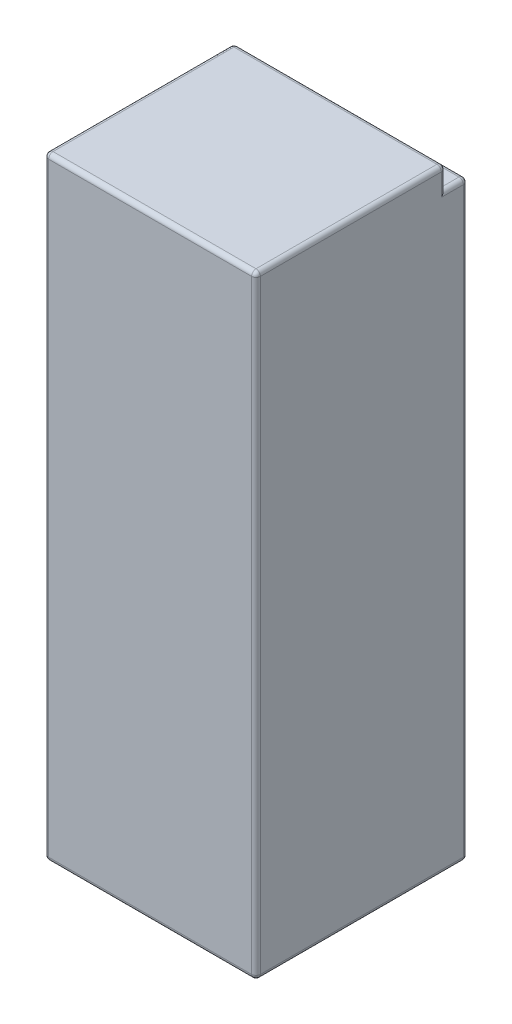
ISO-10303-21;
HEADER;
FILE_DESCRIPTION(('STEP AP214'),'2;1');
FILE_NAME('part.step','',(''),(''),'','','');
FILE_SCHEMA(('AUTOMOTIVE_DESIGN { 1 0 10303 214 1 1 1 1 }'));
ENDSEC;
DATA;
#1=APPLICATION_CONTEXT('core data for automotive mechanical design processes');
#2=APPLICATION_PROTOCOL_DEFINITION('international standard','automotive_design',2000,#1);
#3=PRODUCT_CONTEXT('',#1,'mechanical');
#4=PRODUCT('Part','Part','',(#3));
#5=PRODUCT_RELATED_PRODUCT_CATEGORY('part','',(#4));
#6=PRODUCT_DEFINITION_FORMATION('','',#4);
#7=PRODUCT_DEFINITION_CONTEXT('part definition',#1,'design');
#8=PRODUCT_DEFINITION('design','',#6,#7);
#9=PRODUCT_DEFINITION_SHAPE('','',#8);
#10=(LENGTH_UNIT() NAMED_UNIT(*) SI_UNIT(.MILLI.,.METRE.));
#11=(NAMED_UNIT(*) PLANE_ANGLE_UNIT() SI_UNIT($,.RADIAN.));
#12=(NAMED_UNIT(*) SI_UNIT($,.STERADIAN.) SOLID_ANGLE_UNIT());
#13=UNCERTAINTY_MEASURE_WITH_UNIT(LENGTH_MEASURE(1.E-05),#10,'distance_accuracy_value','');
#14=(GEOMETRIC_REPRESENTATION_CONTEXT(3) GLOBAL_UNCERTAINTY_ASSIGNED_CONTEXT((#13)) GLOBAL_UNIT_ASSIGNED_CONTEXT((#10,
#11,#12)) REPRESENTATION_CONTEXT('',''));
#15=CARTESIAN_POINT('',(0.,0.,0.));
#16=DIRECTION('',(0.,0.,1.));
#17=DIRECTION('',(1.,0.,0.));
#18=AXIS2_PLACEMENT_3D('',#15,#16,#17);
#19=CARTESIAN_POINT('',(-24.,69.5,24.));
#20=DIRECTION('',(1.,0.,0.));
#21=DIRECTION('',(0.,0.,-1.));
#22=AXIS2_PLACEMENT_3D('',#19,#20,#21);
#23=PLANE('',#22);
#24=DIRECTION('',(0.,-1.,0.));
#25=VECTOR('',#24,1.);
#26=CARTESIAN_POINT('',(-24.,69.5,-18.));
#27=LINE('',#26,#25);
#28=CARTESIAN_POINT('',(-24.,68.5,-18.));
#29=VERTEX_POINT('',#28);
#30=CARTESIAN_POINT('',(-24.,63.5,-18.));
#31=VERTEX_POINT('',#30);
#32=EDGE_CURVE('E251',#29,#31,#27,.T.);
#33=ORIENTED_EDGE('',*,*,#32,.T.);
#34=DIRECTION('',(0.,0.,-1.));
#35=VECTOR('',#34,1.);
#36=CARTESIAN_POINT('',(-24.,63.5,24.));
#37=LINE('',#36,#35);
#38=CARTESIAN_POINT('',(-24.,63.5,-23.));
#39=VERTEX_POINT('',#38);
#40=EDGE_CURVE('E203',#31,#39,#37,.T.);
#41=ORIENTED_EDGE('',*,*,#40,.T.);
#42=DIRECTION('',(0.,-1.,0.));
#43=VECTOR('',#42,1.);
#44=CARTESIAN_POINT('',(-24.,69.5,-23.));
#45=LINE('',#44,#43);
#46=CARTESIAN_POINT('',(-24.,-68.5,-23.));
#47=VERTEX_POINT('',#46);
#48=EDGE_CURVE('E253',#39,#47,#45,.T.);
#49=ORIENTED_EDGE('',*,*,#48,.T.);
#50=DIRECTION('',(0.,0.,1.));
#51=VECTOR('',#50,1.);
#52=CARTESIAN_POINT('',(-24.,-68.5,24.));
#53=LINE('',#52,#51);
#54=CARTESIAN_POINT('',(-24.,-68.5,23.));
#55=VERTEX_POINT('',#54);
#56=EDGE_CURVE('E248',#47,#55,#53,.T.);
#57=ORIENTED_EDGE('',*,*,#56,.T.);
#58=DIRECTION('',(0.,-1.,0.));
#59=VECTOR('',#58,1.);
#60=CARTESIAN_POINT('',(-24.,69.5,23.));
#61=LINE('',#60,#59);
#62=CARTESIAN_POINT('',(-24.,68.5,23.));
#63=VERTEX_POINT('',#62);
#64=EDGE_CURVE('E242',#55,#63,#61,.F.);
#65=ORIENTED_EDGE('',*,*,#64,.T.);
#66=DIRECTION('',(0.,0.,1.));
#67=VECTOR('',#66,1.);
#68=CARTESIAN_POINT('',(-24.,68.5,-19.));
#69=LINE('',#68,#67);
#70=EDGE_CURVE('E245',#63,#29,#69,.F.);
#71=ORIENTED_EDGE('',*,*,#70,.T.);
#72=EDGE_LOOP('',(#33,#41,#49,#57,#65,#71));
#73=FACE_BOUND('',#72,.T.);
#74=ADVANCED_FACE('F42',(#73),#23,.F.);
#75=CARTESIAN_POINT('',(24.,69.5,24.));
#76=DIRECTION('',(0.,0.,-1.));
#77=DIRECTION('',(-1.,0.,0.));
#78=AXIS2_PLACEMENT_3D('',#75,#76,#77);
#79=PLANE('',#78);
#80=DIRECTION('',(1.,0.,0.));
#81=VECTOR('',#80,1.);
#82=CARTESIAN_POINT('',(24.,-68.5,24.));
#83=LINE('',#82,#81);
#84=CARTESIAN_POINT('',(-23.,-68.5,24.));
#85=VERTEX_POINT('',#84);
#86=CARTESIAN_POINT('',(23.,-68.5,24.));
#87=VERTEX_POINT('',#86);
#88=EDGE_CURVE('E52',#85,#87,#83,.T.);
#89=ORIENTED_EDGE('',*,*,#88,.T.);
#90=DIRECTION('',(0.,-1.,0.));
#91=VECTOR('',#90,1.);
#92=CARTESIAN_POINT('',(23.,69.5,24.));
#93=LINE('',#92,#91);
#94=CARTESIAN_POINT('',(23.,68.5,24.));
#95=VERTEX_POINT('',#94);
#96=EDGE_CURVE('E11',#87,#95,#93,.F.);
#97=ORIENTED_EDGE('',*,*,#96,.T.);
#98=DIRECTION('',(1.,0.,0.));
#99=VECTOR('',#98,1.);
#100=CARTESIAN_POINT('',(-24.,68.5,24.));
#101=LINE('',#100,#99);
#102=CARTESIAN_POINT('',(-23.,68.5,24.));
#103=VERTEX_POINT('',#102);
#104=EDGE_CURVE('E296',#95,#103,#101,.F.);
#105=ORIENTED_EDGE('',*,*,#104,.T.);
#106=DIRECTION('',(0.,-1.,0.));
#107=VECTOR('',#106,1.);
#108=CARTESIAN_POINT('',(-23.,69.5,24.));
#109=LINE('',#108,#107);
#110=EDGE_CURVE('E293',#103,#85,#109,.T.);
#111=ORIENTED_EDGE('',*,*,#110,.T.);
#112=EDGE_LOOP('',(#89,#97,#105,#111));
#113=FACE_BOUND('',#112,.T.);
#114=ADVANCED_FACE('F465',(#113),#79,.F.);
#115=CARTESIAN_POINT('',(24.,69.5,24.));
#116=DIRECTION('',(-1.,0.,0.));
#117=DIRECTION('',(0.,0.,1.));
#118=AXIS2_PLACEMENT_3D('',#115,#116,#117);
#119=PLANE('',#118);
#120=DIRECTION('',(0.,-1.,0.));
#121=VECTOR('',#120,1.);
#122=CARTESIAN_POINT('',(24.,69.5,-18.));
#123=LINE('',#122,#121);
#124=CARTESIAN_POINT('',(24.,63.5,-18.));
#125=VERTEX_POINT('',#124);
#126=CARTESIAN_POINT('',(24.,68.5,-18.));
#127=VERTEX_POINT('',#126);
#128=EDGE_CURVE('E231',#125,#127,#123,.F.);
#129=ORIENTED_EDGE('',*,*,#128,.T.);
#130=DIRECTION('',(0.,0.,-1.));
#131=VECTOR('',#130,1.);
#132=CARTESIAN_POINT('',(24.,68.5,24.));
#133=LINE('',#132,#131);
#134=CARTESIAN_POINT('',(24.,68.5,23.));
#135=VERTEX_POINT('',#134);
#136=EDGE_CURVE('E237',#127,#135,#133,.F.);
#137=ORIENTED_EDGE('',*,*,#136,.T.);
#138=DIRECTION('',(0.,-1.,0.));
#139=VECTOR('',#138,1.);
#140=CARTESIAN_POINT('',(24.,69.5,23.));
#141=LINE('',#140,#139);
#142=CARTESIAN_POINT('',(24.,-68.5,23.));
#143=VERTEX_POINT('',#142);
#144=EDGE_CURVE('E234',#135,#143,#141,.T.);
#145=ORIENTED_EDGE('',*,*,#144,.T.);
#146=DIRECTION('',(0.,0.,-1.));
#147=VECTOR('',#146,1.);
#148=CARTESIAN_POINT('',(24.,-68.5,24.));
#149=LINE('',#148,#147);
#150=CARTESIAN_POINT('',(24.,-68.5,-23.));
#151=VERTEX_POINT('',#150);
#152=EDGE_CURVE('E226',#143,#151,#149,.T.);
#153=ORIENTED_EDGE('',*,*,#152,.T.);
#154=DIRECTION('',(0.,-1.,0.));
#155=VECTOR('',#154,1.);
#156=CARTESIAN_POINT('',(24.,69.5,-23.));
#157=LINE('',#156,#155);
#158=CARTESIAN_POINT('',(24.,63.5,-23.));
#159=VERTEX_POINT('',#158);
#160=EDGE_CURVE('E219',#151,#159,#157,.F.);
#161=ORIENTED_EDGE('',*,*,#160,.T.);
#162=DIRECTION('',(0.,0.,-1.));
#163=VECTOR('',#162,1.);
#164=CARTESIAN_POINT('',(24.,63.5,24.));
#165=LINE('',#164,#163);
#166=EDGE_CURVE('E229',#159,#125,#165,.F.);
#167=ORIENTED_EDGE('',*,*,#166,.T.);
#168=EDGE_LOOP('',(#129,#137,#145,#153,#161,#167));
#169=FACE_BOUND('',#168,.T.);
#170=ADVANCED_FACE('F447',(#169),#119,.F.);
#171=CARTESIAN_POINT('',(24.,69.5,-24.));
#172=DIRECTION('',(0.,0.,1.));
#173=DIRECTION('',(1.,0.,0.));
#174=AXIS2_PLACEMENT_3D('',#171,#172,#173);
#175=PLANE('',#174);
#176=DIRECTION('',(-1.,0.,0.));
#177=VECTOR('',#176,1.);
#178=CARTESIAN_POINT('',(24.,-68.5,-24.));
#179=LINE('',#178,#177);
#180=CARTESIAN_POINT('',(23.,-68.5,-24.));
#181=VERTEX_POINT('',#180);
#182=CARTESIAN_POINT('',(-23.,-68.5,-24.));
#183=VERTEX_POINT('',#182);
#184=EDGE_CURVE('E272',#181,#183,#179,.T.);
#185=ORIENTED_EDGE('',*,*,#184,.T.);
#186=DIRECTION('',(0.,-1.,0.));
#187=VECTOR('',#186,1.);
#188=CARTESIAN_POINT('',(-23.,69.5,-24.));
#189=LINE('',#188,#187);
#190=CARTESIAN_POINT('',(-23.,63.5,-24.));
#191=VERTEX_POINT('',#190);
#192=EDGE_CURVE('E278',#183,#191,#189,.F.);
#193=ORIENTED_EDGE('',*,*,#192,.T.);
#194=DIRECTION('',(1.,0.,0.));
#195=VECTOR('',#194,1.);
#196=CARTESIAN_POINT('',(24.,63.5,-24.));
#197=LINE('',#196,#195);
#198=CARTESIAN_POINT('',(23.,63.5,-24.));
#199=VERTEX_POINT('',#198);
#200=EDGE_CURVE('E274',#191,#199,#197,.T.);
#201=ORIENTED_EDGE('',*,*,#200,.T.);
#202=DIRECTION('',(0.,-1.,0.));
#203=VECTOR('',#202,1.);
#204=CARTESIAN_POINT('',(23.,69.5,-24.));
#205=LINE('',#204,#203);
#206=EDGE_CURVE('E269',#199,#181,#205,.T.);
#207=ORIENTED_EDGE('',*,*,#206,.T.);
#208=EDGE_LOOP('',(#185,#193,#201,#207));
#209=FACE_BOUND('',#208,.T.);
#210=ADVANCED_FACE('F425',(#209),#175,.F.);
#211=CARTESIAN_POINT('',(0.,69.5,0.));
#212=DIRECTION('',(0.,1.,0.));
#213=DIRECTION('',(0.,0.,1.));
#214=AXIS2_PLACEMENT_3D('',#211,#212,#213);
#215=PLANE('',#214);
#216=DIRECTION('',(0.,0.,-1.));
#217=VECTOR('',#216,1.);
#218=CARTESIAN_POINT('',(23.,69.5,-19.));
#219=LINE('',#218,#217);
#220=CARTESIAN_POINT('',(23.,69.5,23.));
#221=VERTEX_POINT('',#220);
#222=CARTESIAN_POINT('',(23.,69.5,-18.));
#223=VERTEX_POINT('',#222);
#224=EDGE_CURVE('E258',#221,#223,#219,.T.);
#225=ORIENTED_EDGE('',*,*,#224,.T.);
#226=DIRECTION('',(1.,0.,0.));
#227=VECTOR('',#226,1.);
#228=CARTESIAN_POINT('',(-24.,69.5,-18.));
#229=LINE('',#228,#227);
#230=CARTESIAN_POINT('',(-23.,69.5,-18.));
#231=VERTEX_POINT('',#230);
#232=EDGE_CURVE('E265',#223,#231,#229,.F.);
#233=ORIENTED_EDGE('',*,*,#232,.T.);
#234=DIRECTION('',(0.,0.,1.));
#235=VECTOR('',#234,1.);
#236=CARTESIAN_POINT('',(-23.,69.5,24.));
#237=LINE('',#236,#235);
#238=CARTESIAN_POINT('',(-23.,69.5,23.));
#239=VERTEX_POINT('',#238);
#240=EDGE_CURVE('E262',#231,#239,#237,.T.);
#241=ORIENTED_EDGE('',*,*,#240,.T.);
#242=DIRECTION('',(1.,0.,0.));
#243=VECTOR('',#242,1.);
#244=CARTESIAN_POINT('',(24.,69.5,23.));
#245=LINE('',#244,#243);
#246=EDGE_CURVE('E260',#239,#221,#245,.T.);
#247=ORIENTED_EDGE('',*,*,#246,.T.);
#248=EDGE_LOOP('',(#225,#233,#241,#247));
#249=FACE_BOUND('',#248,.T.);
#250=ADVANCED_FACE('F532',(#249),#215,.T.);
#251=CARTESIAN_POINT('',(0.,-69.5,0.));
#252=DIRECTION('',(0.,1.,0.));
#253=DIRECTION('',(0.,0.,1.));
#254=AXIS2_PLACEMENT_3D('',#251,#252,#253);
#255=PLANE('',#254);
#256=DIRECTION('',(1.,0.,0.));
#257=VECTOR('',#256,1.);
#258=CARTESIAN_POINT('',(0.,-69.5,23.));
#259=LINE('',#258,#257);
#260=CARTESIAN_POINT('',(23.,-69.5,23.));
#261=VERTEX_POINT('',#260);
#262=CARTESIAN_POINT('',(-23.,-69.5,23.));
#263=VERTEX_POINT('',#262);
#264=EDGE_CURVE('E286',#261,#263,#259,.F.);
#265=ORIENTED_EDGE('',*,*,#264,.T.);
#266=DIRECTION('',(0.,0.,1.));
#267=VECTOR('',#266,1.);
#268=CARTESIAN_POINT('',(-23.,-69.5,0.));
#269=LINE('',#268,#267);
#270=CARTESIAN_POINT('',(-23.,-69.5,-23.));
#271=VERTEX_POINT('',#270);
#272=EDGE_CURVE('E289',#263,#271,#269,.F.);
#273=ORIENTED_EDGE('',*,*,#272,.T.);
#274=DIRECTION('',(-1.,0.,0.));
#275=VECTOR('',#274,1.);
#276=CARTESIAN_POINT('',(0.,-69.5,-23.));
#277=LINE('',#276,#275);
#278=CARTESIAN_POINT('',(23.,-69.5,-23.));
#279=VERTEX_POINT('',#278);
#280=EDGE_CURVE('E281',#271,#279,#277,.F.);
#281=ORIENTED_EDGE('',*,*,#280,.T.);
#282=DIRECTION('',(0.,0.,-1.));
#283=VECTOR('',#282,1.);
#284=CARTESIAN_POINT('',(23.,-69.5,0.));
#285=LINE('',#284,#283);
#286=EDGE_CURVE('E283',#279,#261,#285,.F.);
#287=ORIENTED_EDGE('',*,*,#286,.T.);
#288=EDGE_LOOP('',(#265,#273,#281,#287));
#289=FACE_BOUND('',#288,.T.);
#290=ADVANCED_FACE('F434',(#289),#255,.F.);
#291=CARTESIAN_POINT('',(-24.,64.5,-24.));
#292=DIRECTION('',(0.,-1.,0.));
#293=DIRECTION('',(0.,0.,-1.));
#294=AXIS2_PLACEMENT_3D('',#291,#292,#293);
#295=PLANE('',#294);
#296=DIRECTION('',(1.,0.,0.));
#297=VECTOR('',#296,1.);
#298=CARTESIAN_POINT('',(-24.,64.5,-19.));
#299=LINE('',#298,#297);
#300=CARTESIAN_POINT('',(-23.,64.5,-19.));
#301=VERTEX_POINT('',#300);
#302=CARTESIAN_POINT('',(23.,64.5,-19.));
#303=VERTEX_POINT('',#302);
#304=EDGE_CURVE('E179',#301,#303,#299,.T.);
#305=ORIENTED_EDGE('',*,*,#304,.T.);
#306=DIRECTION('',(0.,0.,-1.));
#307=VECTOR('',#306,1.);
#308=CARTESIAN_POINT('',(23.,64.5,-24.));
#309=LINE('',#308,#307);
#310=CARTESIAN_POINT('',(23.,64.5,-23.));
#311=VERTEX_POINT('',#310);
#312=EDGE_CURVE('E187',#303,#311,#309,.T.);
#313=ORIENTED_EDGE('',*,*,#312,.T.);
#314=DIRECTION('',(1.,0.,0.));
#315=VECTOR('',#314,1.);
#316=CARTESIAN_POINT('',(-24.,64.5,-23.));
#317=LINE('',#316,#315);
#318=CARTESIAN_POINT('',(-23.,64.5,-23.));
#319=VERTEX_POINT('',#318);
#320=EDGE_CURVE('E181',#311,#319,#317,.F.);
#321=ORIENTED_EDGE('',*,*,#320,.T.);
#322=DIRECTION('',(0.,0.,-1.));
#323=VECTOR('',#322,1.);
#324=CARTESIAN_POINT('',(-23.,64.5,-24.));
#325=LINE('',#324,#323);
#326=EDGE_CURVE('E176',#319,#301,#325,.F.);
#327=ORIENTED_EDGE('',*,*,#326,.T.);
#328=EDGE_LOOP('',(#305,#313,#321,#327));
#329=FACE_BOUND('',#328,.T.);
#330=ADVANCED_FACE('F178',(#329),#295,.F.);
#331=CARTESIAN_POINT('',(-24.,69.5,-19.));
#332=DIRECTION('',(0.,0.,1.));
#333=DIRECTION('',(1.,0.,0.));
#334=AXIS2_PLACEMENT_3D('',#331,#332,#333);
#335=PLANE('',#334);
#336=DIRECTION('',(1.,0.,0.));
#337=VECTOR('',#336,1.);
#338=CARTESIAN_POINT('',(24.,68.5,-19.));
#339=LINE('',#338,#337);
#340=CARTESIAN_POINT('',(-23.,68.5,-19.));
#341=VERTEX_POINT('',#340);
#342=CARTESIAN_POINT('',(23.,68.5,-19.));
#343=VERTEX_POINT('',#342);
#344=EDGE_CURVE('E198',#341,#343,#339,.T.);
#345=ORIENTED_EDGE('',*,*,#344,.T.);
#346=DIRECTION('',(0.,-1.,0.));
#347=VECTOR('',#346,1.);
#348=CARTESIAN_POINT('',(23.,69.5,-19.));
#349=LINE('',#348,#347);
#350=EDGE_CURVE('E196',#343,#303,#349,.T.);
#351=ORIENTED_EDGE('',*,*,#350,.T.);
#352=ORIENTED_EDGE('',*,*,#304,.F.);
#353=DIRECTION('',(0.,-1.,0.));
#354=VECTOR('',#353,1.);
#355=CARTESIAN_POINT('',(-23.,69.5,-19.));
#356=LINE('',#355,#354);
#357=EDGE_CURVE('E193',#301,#341,#356,.F.);
#358=ORIENTED_EDGE('',*,*,#357,.T.);
#359=EDGE_LOOP('',(#345,#351,#352,#358));
#360=FACE_BOUND('',#359,.T.);
#361=ADVANCED_FACE('F191',(#360),#335,.F.);
#362=CARTESIAN_POINT('',(-23.,-68.5,23.));
#363=DIRECTION('',(0.,-1.,0.));
#364=DIRECTION('',(0.,0.,-1.));
#365=AXIS2_PLACEMENT_3D('',#362,#363,#364);
#366=SPHERICAL_SURFACE('',#365,1.);
#367=CARTESIAN_POINT('',(-23.,-68.5,23.));
#368=DIRECTION('',(0.,-1.,0.));
#369=DIRECTION('',(0.,0.,-1.));
#370=AXIS2_PLACEMENT_3D('',#367,#368,#369);
#371=CIRCLE('',#370,1.);
#372=EDGE_CURVE('E382',#55,#85,#371,.F.);
#373=ORIENTED_EDGE('',*,*,#372,.F.);
#374=CARTESIAN_POINT('',(-23.,-68.5,23.));
#375=DIRECTION('',(0.,0.,1.));
#376=DIRECTION('',(1.,0.,0.));
#377=AXIS2_PLACEMENT_3D('',#374,#375,#376);
#378=CIRCLE('',#377,1.);
#379=EDGE_CURVE('E46',#263,#55,#378,.F.);
#380=ORIENTED_EDGE('',*,*,#379,.F.);
#381=CARTESIAN_POINT('',(-23.,-68.5,23.));
#382=DIRECTION('',(-1.,0.,0.));
#383=DIRECTION('',(0.,0.,1.));
#384=AXIS2_PLACEMENT_3D('',#381,#382,#383);
#385=CIRCLE('',#384,1.);
#386=EDGE_CURVE('E385',#85,#263,#385,.F.);
#387=ORIENTED_EDGE('',*,*,#386,.F.);
#388=EDGE_LOOP('',(#373,#380,#387));
#389=FACE_BOUND('',#388,.T.);
#390=ADVANCED_FACE('F44',(#389),#366,.T.);
#391=CARTESIAN_POINT('',(-23.,-68.5,24.));
#392=DIRECTION('',(0.,0.,1.));
#393=DIRECTION('',(1.,0.,0.));
#394=AXIS2_PLACEMENT_3D('',#391,#392,#393);
#395=CYLINDRICAL_SURFACE('',#394,1.);
#396=ORIENTED_EDGE('',*,*,#379,.T.);
#397=ORIENTED_EDGE('',*,*,#56,.F.);
#398=CARTESIAN_POINT('',(-23.,-68.5,-23.));
#399=DIRECTION('',(0.,0.,-1.));
#400=DIRECTION('',(-1.,0.,0.));
#401=AXIS2_PLACEMENT_3D('',#398,#399,#400);
#402=CIRCLE('',#401,1.);
#403=EDGE_CURVE('E379',#271,#47,#402,.T.);
#404=ORIENTED_EDGE('',*,*,#403,.F.);
#405=ORIENTED_EDGE('',*,*,#272,.F.);
#406=EDGE_LOOP('',(#396,#397,#404,#405));
#407=FACE_BOUND('',#406,.T.);
#408=ADVANCED_FACE('F399',(#407),#395,.T.);
#409=CARTESIAN_POINT('',(24.,-68.5,23.));
#410=DIRECTION('',(1.,0.,0.));
#411=DIRECTION('',(0.,0.,-1.));
#412=AXIS2_PLACEMENT_3D('',#409,#410,#411);
#413=CYLINDRICAL_SURFACE('',#412,1.);
#414=ORIENTED_EDGE('',*,*,#386,.T.);
#415=ORIENTED_EDGE('',*,*,#264,.F.);
#416=CARTESIAN_POINT('',(23.,-68.5,23.));
#417=DIRECTION('',(1.,0.,0.));
#418=DIRECTION('',(0.,0.,-1.));
#419=AXIS2_PLACEMENT_3D('',#416,#417,#418);
#420=CIRCLE('',#419,1.);
#421=EDGE_CURVE('E375',#87,#261,#420,.T.);
#422=ORIENTED_EDGE('',*,*,#421,.F.);
#423=ORIENTED_EDGE('',*,*,#88,.F.);
#424=EDGE_LOOP('',(#414,#415,#422,#423));
#425=FACE_BOUND('',#424,.T.);
#426=ADVANCED_FACE('F437',(#425),#413,.T.);
#427=CARTESIAN_POINT('',(-23.,69.5,23.));
#428=DIRECTION('',(0.,-1.,0.));
#429=DIRECTION('',(0.,0.,-1.));
#430=AXIS2_PLACEMENT_3D('',#427,#428,#429);
#431=CYLINDRICAL_SURFACE('',#430,1.);
#432=ORIENTED_EDGE('',*,*,#372,.T.);
#433=ORIENTED_EDGE('',*,*,#110,.F.);
#434=CARTESIAN_POINT('',(-23.,68.5,23.));
#435=DIRECTION('',(0.,1.,0.));
#436=DIRECTION('',(0.,0.,1.));
#437=AXIS2_PLACEMENT_3D('',#434,#435,#436);
#438=CIRCLE('',#437,1.);
#439=EDGE_CURVE('E372',#63,#103,#438,.T.);
#440=ORIENTED_EDGE('',*,*,#439,.F.);
#441=ORIENTED_EDGE('',*,*,#64,.F.);
#442=EDGE_LOOP('',(#432,#433,#440,#441));
#443=FACE_BOUND('',#442,.T.);
#444=ADVANCED_FACE('F406',(#443),#431,.T.);
#445=CARTESIAN_POINT('',(-23.,-68.5,-23.));
#446=DIRECTION('',(-1.,0.,0.));
#447=DIRECTION('',(0.,0.,1.));
#448=AXIS2_PLACEMENT_3D('',#445,#446,#447);
#449=SPHERICAL_SURFACE('',#448,1.);
#450=CARTESIAN_POINT('',(-23.,-68.5,-23.));
#451=DIRECTION('',(-1.,0.,0.));
#452=DIRECTION('',(0.,0.,1.));
#453=AXIS2_PLACEMENT_3D('',#450,#451,#452);
#454=CIRCLE('',#453,1.);
#455=EDGE_CURVE('E366',#271,#183,#454,.F.);
#456=ORIENTED_EDGE('',*,*,#455,.F.);
#457=ORIENTED_EDGE('',*,*,#403,.T.);
#458=CARTESIAN_POINT('',(-23.,-68.5,-23.));
#459=DIRECTION('',(0.,-1.,0.));
#460=DIRECTION('',(0.,0.,-1.));
#461=AXIS2_PLACEMENT_3D('',#458,#459,#460);
#462=CIRCLE('',#461,1.);
#463=EDGE_CURVE('E369',#183,#47,#462,.F.);
#464=ORIENTED_EDGE('',*,*,#463,.F.);
#465=EDGE_LOOP('',(#456,#457,#464));
#466=FACE_BOUND('',#465,.T.);
#467=ADVANCED_FACE('F432',(#466),#449,.T.);
#468=CARTESIAN_POINT('',(23.,-68.5,23.));
#469=DIRECTION('',(0.,-1.,0.));
#470=DIRECTION('',(0.,0.,-1.));
#471=AXIS2_PLACEMENT_3D('',#468,#469,#470);
#472=SPHERICAL_SURFACE('',#471,1.);
#473=CARTESIAN_POINT('',(23.,-68.5,23.));
#474=DIRECTION('',(0.,-1.,0.));
#475=DIRECTION('',(0.,0.,-1.));
#476=AXIS2_PLACEMENT_3D('',#473,#474,#475);
#477=CIRCLE('',#476,1.);
#478=EDGE_CURVE('E359',#87,#143,#477,.F.);
#479=ORIENTED_EDGE('',*,*,#478,.F.);
#480=ORIENTED_EDGE('',*,*,#421,.T.);
#481=CARTESIAN_POINT('',(23.,-68.5,23.));
#482=DIRECTION('',(0.,0.,1.));
#483=DIRECTION('',(1.,0.,0.));
#484=AXIS2_PLACEMENT_3D('',#481,#482,#483);
#485=CIRCLE('',#484,1.);
#486=EDGE_CURVE('E362',#143,#261,#485,.F.);
#487=ORIENTED_EDGE('',*,*,#486,.F.);
#488=EDGE_LOOP('',(#479,#480,#487));
#489=FACE_BOUND('',#488,.T.);
#490=ADVANCED_FACE('F440',(#489),#472,.T.);
#491=CARTESIAN_POINT('',(-23.,68.5,23.));
#492=DIRECTION('',(0.,0.,1.));
#493=DIRECTION('',(1.,0.,0.));
#494=AXIS2_PLACEMENT_3D('',#491,#492,#493);
#495=SPHERICAL_SURFACE('',#494,1.);
#496=CARTESIAN_POINT('',(-23.,68.5,23.));
#497=DIRECTION('',(0.,0.,1.));
#498=DIRECTION('',(1.,0.,0.));
#499=AXIS2_PLACEMENT_3D('',#496,#497,#498);
#500=CIRCLE('',#499,1.);
#501=EDGE_CURVE('E208',#63,#239,#500,.F.);
#502=ORIENTED_EDGE('',*,*,#501,.F.);
#503=ORIENTED_EDGE('',*,*,#439,.T.);
#504=CARTESIAN_POINT('',(-23.,68.5,23.));
#505=DIRECTION('',(-1.,0.,0.));
#506=DIRECTION('',(0.,0.,1.));
#507=AXIS2_PLACEMENT_3D('',#504,#505,#506);
#508=CIRCLE('',#507,1.);
#509=EDGE_CURVE('E356',#239,#103,#508,.F.);
#510=ORIENTED_EDGE('',*,*,#509,.F.);
#511=EDGE_LOOP('',(#502,#503,#510));
#512=FACE_BOUND('',#511,.T.);
#513=ADVANCED_FACE('F528',(#512),#495,.T.);
#514=CARTESIAN_POINT('',(-23.,63.5,24.));
#515=DIRECTION('',(0.,0.,-1.));
#516=DIRECTION('',(-1.,0.,0.));
#517=AXIS2_PLACEMENT_3D('',#514,#515,#516);
#518=CYLINDRICAL_SURFACE('',#517,1.);
#519=CARTESIAN_POINT('',(-23.,63.5,-23.));
#520=DIRECTION('',(0.,0.,-1.));
#521=DIRECTION('',(-1.,0.,0.));
#522=AXIS2_PLACEMENT_3D('',#519,#520,#521);
#523=CIRCLE('',#522,1.);
#524=EDGE_CURVE('E209',#39,#319,#523,.T.);
#525=ORIENTED_EDGE('',*,*,#524,.F.);
#526=ORIENTED_EDGE('',*,*,#40,.F.);
#527=CARTESIAN_POINT('',(-23.,63.5,-18.));
#528=DIRECTION('',(0.,-0.707106781186547,-0.707106781186547));
#529=DIRECTION('',(0.,-0.707106781186547,0.707106781186547));
#530=AXIS2_PLACEMENT_3D('',#527,#528,#529);
#531=ELLIPSE('',#530,1.41421356237309,1.);
#532=EDGE_CURVE('E201',#301,#31,#531,.F.);
#533=ORIENTED_EDGE('',*,*,#532,.F.);
#534=ORIENTED_EDGE('',*,*,#326,.F.);
#535=EDGE_LOOP('',(#525,#526,#533,#534));
#536=FACE_BOUND('',#535,.T.);
#537=ADVANCED_FACE('F202',(#536),#518,.T.);
#538=CARTESIAN_POINT('',(-23.,69.5,-23.));
#539=DIRECTION('',(0.,-1.,0.));
#540=DIRECTION('',(0.,0.,-1.));
#541=AXIS2_PLACEMENT_3D('',#538,#539,#540);
#542=CYLINDRICAL_SURFACE('',#541,1.);
#543=ORIENTED_EDGE('',*,*,#463,.T.);
#544=ORIENTED_EDGE('',*,*,#48,.F.);
#545=CARTESIAN_POINT('',(-23.,63.5,-23.));
#546=DIRECTION('',(0.,1.,0.));
#547=DIRECTION('',(0.,0.,1.));
#548=AXIS2_PLACEMENT_3D('',#545,#546,#547);
#549=CIRCLE('',#548,1.);
#550=EDGE_CURVE('E348',#191,#39,#549,.T.);
#551=ORIENTED_EDGE('',*,*,#550,.F.);
#552=ORIENTED_EDGE('',*,*,#192,.F.);
#553=EDGE_LOOP('',(#543,#544,#551,#552));
#554=FACE_BOUND('',#553,.T.);
#555=ADVANCED_FACE('F413',(#554),#542,.T.);
#556=CARTESIAN_POINT('',(24.,-68.5,-23.));
#557=DIRECTION('',(-1.,0.,0.));
#558=DIRECTION('',(0.,0.,1.));
#559=AXIS2_PLACEMENT_3D('',#556,#557,#558);
#560=CYLINDRICAL_SURFACE('',#559,1.);
#561=ORIENTED_EDGE('',*,*,#455,.T.);
#562=ORIENTED_EDGE('',*,*,#184,.F.);
#563=CARTESIAN_POINT('',(23.,-68.5,-23.));
#564=DIRECTION('',(1.,0.,0.));
#565=DIRECTION('',(0.,0.,-1.));
#566=AXIS2_PLACEMENT_3D('',#563,#564,#565);
#567=CIRCLE('',#566,1.);
#568=EDGE_CURVE('E345',#279,#181,#567,.T.);
#569=ORIENTED_EDGE('',*,*,#568,.F.);
#570=ORIENTED_EDGE('',*,*,#280,.F.);
#571=EDGE_LOOP('',(#561,#562,#569,#570));
#572=FACE_BOUND('',#571,.T.);
#573=ADVANCED_FACE('F430',(#572),#560,.T.);
#574=CARTESIAN_POINT('',(23.,-68.5,24.));
#575=DIRECTION('',(0.,0.,-1.));
#576=DIRECTION('',(-1.,0.,0.));
#577=AXIS2_PLACEMENT_3D('',#574,#575,#576);
#578=CYLINDRICAL_SURFACE('',#577,1.);
#579=ORIENTED_EDGE('',*,*,#486,.T.);
#580=ORIENTED_EDGE('',*,*,#286,.F.);
#581=CARTESIAN_POINT('',(23.,-68.5,-23.));
#582=DIRECTION('',(0.,0.,-1.));
#583=DIRECTION('',(-1.,0.,0.));
#584=AXIS2_PLACEMENT_3D('',#581,#582,#583);
#585=CIRCLE('',#584,1.);
#586=EDGE_CURVE('E342',#151,#279,#585,.T.);
#587=ORIENTED_EDGE('',*,*,#586,.F.);
#588=ORIENTED_EDGE('',*,*,#152,.F.);
#589=EDGE_LOOP('',(#579,#580,#587,#588));
#590=FACE_BOUND('',#589,.T.);
#591=ADVANCED_FACE('F443',(#590),#578,.T.);
#592=CARTESIAN_POINT('',(23.,69.5,23.));
#593=DIRECTION('',(0.,-1.,0.));
#594=DIRECTION('',(0.,0.,-1.));
#595=AXIS2_PLACEMENT_3D('',#592,#593,#594);
#596=CYLINDRICAL_SURFACE('',#595,1.);
#597=ORIENTED_EDGE('',*,*,#478,.T.);
#598=ORIENTED_EDGE('',*,*,#144,.F.);
#599=CARTESIAN_POINT('',(23.,68.5,23.));
#600=DIRECTION('',(0.,1.,0.));
#601=DIRECTION('',(0.,0.,1.));
#602=AXIS2_PLACEMENT_3D('',#599,#600,#601);
#603=CIRCLE('',#602,1.);
#604=EDGE_CURVE('E339',#95,#135,#603,.T.);
#605=ORIENTED_EDGE('',*,*,#604,.F.);
#606=ORIENTED_EDGE('',*,*,#96,.F.);
#607=EDGE_LOOP('',(#597,#598,#605,#606));
#608=FACE_BOUND('',#607,.T.);
#609=ADVANCED_FACE('F452',(#608),#596,.T.);
#610=CARTESIAN_POINT('',(0.,68.5,23.));
#611=DIRECTION('',(-1.,0.,0.));
#612=DIRECTION('',(0.,0.,1.));
#613=AXIS2_PLACEMENT_3D('',#610,#611,#612);
#614=CYLINDRICAL_SURFACE('',#613,1.);
#615=ORIENTED_EDGE('',*,*,#509,.T.);
#616=ORIENTED_EDGE('',*,*,#104,.F.);
#617=CARTESIAN_POINT('',(23.,68.5,23.));
#618=DIRECTION('',(1.,0.,0.));
#619=DIRECTION('',(0.,0.,-1.));
#620=AXIS2_PLACEMENT_3D('',#617,#618,#619);
#621=CIRCLE('',#620,1.);
#622=EDGE_CURVE('E336',#221,#95,#621,.T.);
#623=ORIENTED_EDGE('',*,*,#622,.F.);
#624=ORIENTED_EDGE('',*,*,#246,.F.);
#625=EDGE_LOOP('',(#615,#616,#623,#624));
#626=FACE_BOUND('',#625,.T.);
#627=ADVANCED_FACE('F454',(#626),#614,.T.);
#628=CARTESIAN_POINT('',(-23.,68.5,0.));
#629=DIRECTION('',(0.,0.,-1.));
#630=DIRECTION('',(-1.,0.,0.));
#631=AXIS2_PLACEMENT_3D('',#628,#629,#630);
#632=CYLINDRICAL_SURFACE('',#631,1.);
#633=ORIENTED_EDGE('',*,*,#501,.T.);
#634=ORIENTED_EDGE('',*,*,#240,.F.);
#635=CARTESIAN_POINT('',(-23.,68.5,-18.));
#636=DIRECTION('',(0.,0.,-1.));
#637=DIRECTION('',(-1.,0.,0.));
#638=AXIS2_PLACEMENT_3D('',#635,#636,#637);
#639=CIRCLE('',#638,1.);
#640=EDGE_CURVE('E332',#29,#231,#639,.T.);
#641=ORIENTED_EDGE('',*,*,#640,.F.);
#642=ORIENTED_EDGE('',*,*,#70,.F.);
#643=EDGE_LOOP('',(#633,#634,#641,#642));
#644=FACE_BOUND('',#643,.T.);
#645=ADVANCED_FACE('F460',(#644),#632,.T.);
#646=CARTESIAN_POINT('',(-23.,69.5,-18.));
#647=DIRECTION('',(0.,-1.,0.));
#648=DIRECTION('',(0.,0.,-1.));
#649=AXIS2_PLACEMENT_3D('',#646,#647,#648);
#650=CYLINDRICAL_SURFACE('',#649,1.);
#651=ORIENTED_EDGE('',*,*,#532,.T.);
#652=ORIENTED_EDGE('',*,*,#32,.F.);
#653=CARTESIAN_POINT('',(-23.,68.5,-18.));
#654=DIRECTION('',(0.,1.,0.));
#655=DIRECTION('',(0.,0.,1.));
#656=AXIS2_PLACEMENT_3D('',#653,#654,#655);
#657=CIRCLE('',#656,1.);
#658=EDGE_CURVE('E213',#341,#29,#657,.T.);
#659=ORIENTED_EDGE('',*,*,#658,.F.);
#660=ORIENTED_EDGE('',*,*,#357,.F.);
#661=EDGE_LOOP('',(#651,#652,#659,#660));
#662=FACE_BOUND('',#661,.T.);
#663=ADVANCED_FACE('F211',(#662),#650,.T.);
#664=CARTESIAN_POINT('',(-23.,63.5,-23.));
#665=DIRECTION('',(-1.,0.,0.));
#666=DIRECTION('',(0.,0.,1.));
#667=AXIS2_PLACEMENT_3D('',#664,#665,#666);
#668=SPHERICAL_SURFACE('',#667,1.);
#669=ORIENTED_EDGE('',*,*,#550,.T.);
#670=ORIENTED_EDGE('',*,*,#524,.T.);
#671=CARTESIAN_POINT('',(-23.,63.5,-23.));
#672=DIRECTION('',(-1.,0.,0.));
#673=DIRECTION('',(0.,0.,1.));
#674=AXIS2_PLACEMENT_3D('',#671,#672,#673);
#675=CIRCLE('',#674,1.);
#676=EDGE_CURVE('E327',#191,#319,#675,.F.);
#677=ORIENTED_EDGE('',*,*,#676,.F.);
#678=EDGE_LOOP('',(#669,#670,#677));
#679=FACE_BOUND('',#678,.T.);
#680=ADVANCED_FACE('F418',(#679),#668,.T.);
#681=CARTESIAN_POINT('',(23.,-68.5,-23.));
#682=DIRECTION('',(0.,-1.,0.));
#683=DIRECTION('',(0.,0.,-1.));
#684=AXIS2_PLACEMENT_3D('',#681,#682,#683);
#685=SPHERICAL_SURFACE('',#684,1.);
#686=ORIENTED_EDGE('',*,*,#586,.T.);
#687=ORIENTED_EDGE('',*,*,#568,.T.);
#688=CARTESIAN_POINT('',(23.,-68.5,-23.));
#689=DIRECTION('',(0.,-1.,0.));
#690=DIRECTION('',(0.,0.,-1.));
#691=AXIS2_PLACEMENT_3D('',#688,#689,#690);
#692=CIRCLE('',#691,1.);
#693=EDGE_CURVE('E324',#151,#181,#692,.F.);
#694=ORIENTED_EDGE('',*,*,#693,.F.);
#695=EDGE_LOOP('',(#686,#687,#694));
#696=FACE_BOUND('',#695,.T.);
#697=ADVANCED_FACE('F510',(#696),#685,.T.);
#698=CARTESIAN_POINT('',(23.,68.5,23.));
#699=DIRECTION('',(0.,0.,1.));
#700=DIRECTION('',(1.,0.,0.));
#701=AXIS2_PLACEMENT_3D('',#698,#699,#700);
#702=SPHERICAL_SURFACE('',#701,1.);
#703=ORIENTED_EDGE('',*,*,#622,.T.);
#704=ORIENTED_EDGE('',*,*,#604,.T.);
#705=CARTESIAN_POINT('',(23.,68.5,23.));
#706=DIRECTION('',(0.,0.,1.));
#707=DIRECTION('',(1.,0.,0.));
#708=AXIS2_PLACEMENT_3D('',#705,#706,#707);
#709=CIRCLE('',#708,1.);
#710=EDGE_CURVE('E321',#221,#135,#709,.F.);
#711=ORIENTED_EDGE('',*,*,#710,.F.);
#712=EDGE_LOOP('',(#703,#704,#711));
#713=FACE_BOUND('',#712,.T.);
#714=ADVANCED_FACE('F506',(#713),#702,.T.);
#715=CARTESIAN_POINT('',(-23.,68.5,-18.));
#716=DIRECTION('',(-1.,0.,0.));
#717=DIRECTION('',(0.,0.,1.));
#718=AXIS2_PLACEMENT_3D('',#715,#716,#717);
#719=SPHERICAL_SURFACE('',#718,1.);
#720=ORIENTED_EDGE('',*,*,#658,.T.);
#721=ORIENTED_EDGE('',*,*,#640,.T.);
#722=CARTESIAN_POINT('',(-23.,68.5,-18.));
#723=DIRECTION('',(-1.,0.,0.));
#724=DIRECTION('',(0.,0.,1.));
#725=AXIS2_PLACEMENT_3D('',#722,#723,#724);
#726=CIRCLE('',#725,1.);
#727=EDGE_CURVE('E318',#341,#231,#726,.F.);
#728=ORIENTED_EDGE('',*,*,#727,.F.);
#729=EDGE_LOOP('',(#720,#721,#728));
#730=FACE_BOUND('',#729,.T.);
#731=ADVANCED_FACE('F503',(#730),#719,.T.);
#732=CARTESIAN_POINT('',(24.,63.5,-23.));
#733=DIRECTION('',(1.,0.,0.));
#734=DIRECTION('',(0.,0.,-1.));
#735=AXIS2_PLACEMENT_3D('',#732,#733,#734);
#736=CYLINDRICAL_SURFACE('',#735,1.);
#737=ORIENTED_EDGE('',*,*,#676,.T.);
#738=ORIENTED_EDGE('',*,*,#320,.F.);
#739=CARTESIAN_POINT('',(23.,63.5,-23.));
#740=DIRECTION('',(1.,0.,0.));
#741=DIRECTION('',(0.,0.,-1.));
#742=AXIS2_PLACEMENT_3D('',#739,#740,#741);
#743=CIRCLE('',#742,1.);
#744=EDGE_CURVE('E315',#199,#311,#743,.T.);
#745=ORIENTED_EDGE('',*,*,#744,.F.);
#746=ORIENTED_EDGE('',*,*,#200,.F.);
#747=EDGE_LOOP('',(#737,#738,#745,#746));
#748=FACE_BOUND('',#747,.T.);
#749=ADVANCED_FACE('F422',(#748),#736,.T.);
#750=CARTESIAN_POINT('',(23.,69.5,-23.));
#751=DIRECTION('',(0.,-1.,0.));
#752=DIRECTION('',(0.,0.,-1.));
#753=AXIS2_PLACEMENT_3D('',#750,#751,#752);
#754=CYLINDRICAL_SURFACE('',#753,1.);
#755=ORIENTED_EDGE('',*,*,#693,.T.);
#756=ORIENTED_EDGE('',*,*,#206,.F.);
#757=CARTESIAN_POINT('',(23.,63.5,-23.));
#758=DIRECTION('',(0.,1.,0.));
#759=DIRECTION('',(0.,0.,1.));
#760=AXIS2_PLACEMENT_3D('',#757,#758,#759);
#761=CIRCLE('',#760,1.);
#762=EDGE_CURVE('E313',#159,#199,#761,.T.);
#763=ORIENTED_EDGE('',*,*,#762,.F.);
#764=ORIENTED_EDGE('',*,*,#160,.F.);
#765=EDGE_LOOP('',(#755,#756,#763,#764));
#766=FACE_BOUND('',#765,.T.);
#767=ADVANCED_FACE('F496',(#766),#754,.T.);
#768=CARTESIAN_POINT('',(23.,68.5,0.));
#769=DIRECTION('',(0.,0.,1.));
#770=DIRECTION('',(1.,0.,0.));
#771=AXIS2_PLACEMENT_3D('',#768,#769,#770);
#772=CYLINDRICAL_SURFACE('',#771,1.);
#773=ORIENTED_EDGE('',*,*,#710,.T.);
#774=ORIENTED_EDGE('',*,*,#136,.F.);
#775=CARTESIAN_POINT('',(23.,68.5,-18.));
#776=DIRECTION('',(0.,0.,-1.));
#777=DIRECTION('',(-1.,0.,0.));
#778=AXIS2_PLACEMENT_3D('',#775,#776,#777);
#779=CIRCLE('',#778,1.);
#780=EDGE_CURVE('E310',#223,#127,#779,.T.);
#781=ORIENTED_EDGE('',*,*,#780,.F.);
#782=ORIENTED_EDGE('',*,*,#224,.F.);
#783=EDGE_LOOP('',(#773,#774,#781,#782));
#784=FACE_BOUND('',#783,.T.);
#785=ADVANCED_FACE('F492',(#784),#772,.T.);
#786=CARTESIAN_POINT('',(-24.,68.5,-18.));
#787=DIRECTION('',(-1.,0.,0.));
#788=DIRECTION('',(0.,0.,1.));
#789=AXIS2_PLACEMENT_3D('',#786,#787,#788);
#790=CYLINDRICAL_SURFACE('',#789,1.);
#791=ORIENTED_EDGE('',*,*,#727,.T.);
#792=ORIENTED_EDGE('',*,*,#232,.F.);
#793=CARTESIAN_POINT('',(23.,68.5,-18.));
#794=DIRECTION('',(1.,0.,0.));
#795=DIRECTION('',(0.,0.,-1.));
#796=AXIS2_PLACEMENT_3D('',#793,#794,#795);
#797=CIRCLE('',#796,1.);
#798=EDGE_CURVE('E307',#343,#223,#797,.T.);
#799=ORIENTED_EDGE('',*,*,#798,.F.);
#800=ORIENTED_EDGE('',*,*,#344,.F.);
#801=EDGE_LOOP('',(#791,#792,#799,#800));
#802=FACE_BOUND('',#801,.T.);
#803=ADVANCED_FACE('F488',(#802),#790,.T.);
#804=CARTESIAN_POINT('',(23.,63.5,-23.));
#805=DIRECTION('',(0.,0.,-1.));
#806=DIRECTION('',(-1.,0.,0.));
#807=AXIS2_PLACEMENT_3D('',#804,#805,#806);
#808=SPHERICAL_SURFACE('',#807,1.);
#809=ORIENTED_EDGE('',*,*,#762,.T.);
#810=ORIENTED_EDGE('',*,*,#744,.T.);
#811=CARTESIAN_POINT('',(23.,63.5,-23.));
#812=DIRECTION('',(0.,0.,-1.));
#813=DIRECTION('',(-1.,0.,0.));
#814=AXIS2_PLACEMENT_3D('',#811,#812,#813);
#815=CIRCLE('',#814,1.);
#816=EDGE_CURVE('E304',#159,#311,#815,.F.);
#817=ORIENTED_EDGE('',*,*,#816,.F.);
#818=EDGE_LOOP('',(#809,#810,#817));
#819=FACE_BOUND('',#818,.T.);
#820=ADVANCED_FACE('F484',(#819),#808,.T.);
#821=CARTESIAN_POINT('',(23.,68.5,-18.));
#822=DIRECTION('',(0.,1.,0.));
#823=DIRECTION('',(0.,0.,1.));
#824=AXIS2_PLACEMENT_3D('',#821,#822,#823);
#825=SPHERICAL_SURFACE('',#824,1.);
#826=ORIENTED_EDGE('',*,*,#798,.T.);
#827=ORIENTED_EDGE('',*,*,#780,.T.);
#828=CARTESIAN_POINT('',(23.,68.5,-18.));
#829=DIRECTION('',(0.,1.,0.));
#830=DIRECTION('',(0.,0.,1.));
#831=AXIS2_PLACEMENT_3D('',#828,#829,#830);
#832=CIRCLE('',#831,1.);
#833=EDGE_CURVE('E302',#343,#127,#832,.F.);
#834=ORIENTED_EDGE('',*,*,#833,.F.);
#835=EDGE_LOOP('',(#826,#827,#834));
#836=FACE_BOUND('',#835,.T.);
#837=ADVANCED_FACE('F480',(#836),#825,.T.);
#838=CARTESIAN_POINT('',(23.,63.5,-24.));
#839=DIRECTION('',(0.,0.,-1.));
#840=DIRECTION('',(-1.,0.,0.));
#841=AXIS2_PLACEMENT_3D('',#838,#839,#840);
#842=CYLINDRICAL_SURFACE('',#841,1.);
#843=ORIENTED_EDGE('',*,*,#816,.T.);
#844=ORIENTED_EDGE('',*,*,#312,.F.);
#845=CARTESIAN_POINT('',(23.,63.5,-18.));
#846=DIRECTION('',(0.,-0.707106781186547,-0.707106781186547));
#847=DIRECTION('',(0.,-0.707106781186547,0.707106781186547));
#848=AXIS2_PLACEMENT_3D('',#845,#846,#847);
#849=ELLIPSE('',#848,1.41421356237309,1.);
#850=EDGE_CURVE('E300',#125,#303,#849,.F.);
#851=ORIENTED_EDGE('',*,*,#850,.F.);
#852=ORIENTED_EDGE('',*,*,#166,.F.);
#853=EDGE_LOOP('',(#843,#844,#851,#852));
#854=FACE_BOUND('',#853,.T.);
#855=ADVANCED_FACE('F476',(#854),#842,.T.);
#856=CARTESIAN_POINT('',(23.,69.5,-18.));
#857=DIRECTION('',(0.,-1.,0.));
#858=DIRECTION('',(0.,0.,-1.));
#859=AXIS2_PLACEMENT_3D('',#856,#857,#858);
#860=CYLINDRICAL_SURFACE('',#859,1.);
#861=ORIENTED_EDGE('',*,*,#833,.T.);
#862=ORIENTED_EDGE('',*,*,#128,.F.);
#863=ORIENTED_EDGE('',*,*,#850,.T.);
#864=ORIENTED_EDGE('',*,*,#350,.F.);
#865=EDGE_LOOP('',(#861,#862,#863,#864));
#866=FACE_BOUND('',#865,.T.);
#867=ADVANCED_FACE('F473',(#866),#860,.T.);
#868=CLOSED_SHELL('',(#74,#114,#170,#210,#250,#290,#330,#361,#390,#408,#426,#444,#467,#490,#513,
#537,#555,#573,#591,#609,#627,#645,#663,#680,#697,#714,#731,#749,#767,#785,#803,#820,#837,#855,#867));
#869=MANIFOLD_SOLID_BREP('B2',#868);
#870=ADVANCED_BREP_SHAPE_REPRESENTATION('',(#18,#869),#14);
#871=SHAPE_DEFINITION_REPRESENTATION(#9,#870);
ENDSEC;
END-ISO-10303-21;
